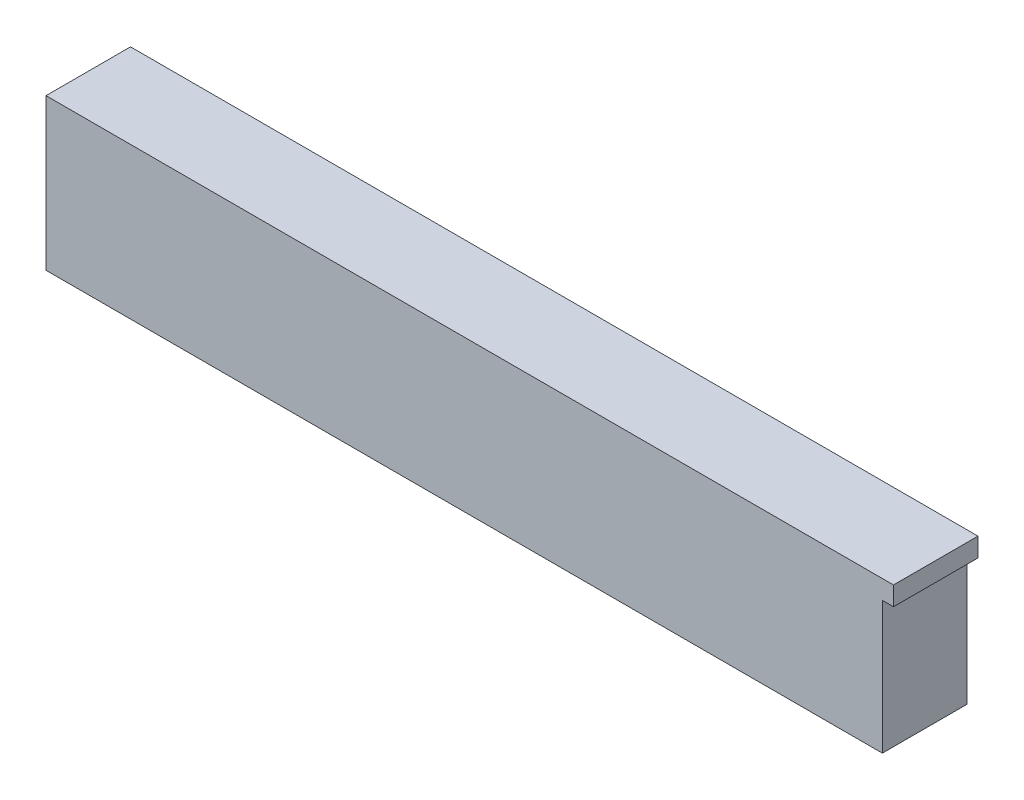
ISO-10303-21;
HEADER;
FILE_DESCRIPTION(('STEP AP214'),'2;1');
FILE_NAME('part.step','',(''),(''),'','','');
FILE_SCHEMA(('AUTOMOTIVE_DESIGN { 1 0 10303 214 1 1 1 1 }'));
ENDSEC;
DATA;
#1=APPLICATION_CONTEXT('core data for automotive mechanical design processes');
#2=APPLICATION_PROTOCOL_DEFINITION('international standard','automotive_design',2000,#1);
#3=PRODUCT_CONTEXT('',#1,'mechanical');
#4=PRODUCT('Part','Part','',(#3));
#5=PRODUCT_RELATED_PRODUCT_CATEGORY('part','',(#4));
#6=PRODUCT_DEFINITION_FORMATION('','',#4);
#7=PRODUCT_DEFINITION_CONTEXT('part definition',#1,'design');
#8=PRODUCT_DEFINITION('design','',#6,#7);
#9=PRODUCT_DEFINITION_SHAPE('','',#8);
#10=(LENGTH_UNIT() NAMED_UNIT(*) SI_UNIT(.MILLI.,.METRE.));
#11=(NAMED_UNIT(*) PLANE_ANGLE_UNIT() SI_UNIT($,.RADIAN.));
#12=(NAMED_UNIT(*) SI_UNIT($,.STERADIAN.) SOLID_ANGLE_UNIT());
#13=UNCERTAINTY_MEASURE_WITH_UNIT(LENGTH_MEASURE(1.E-05),#10,'distance_accuracy_value','');
#14=(GEOMETRIC_REPRESENTATION_CONTEXT(3) GLOBAL_UNCERTAINTY_ASSIGNED_CONTEXT((#13)) GLOBAL_UNIT_ASSIGNED_CONTEXT((#10,
#11,#12)) REPRESENTATION_CONTEXT('',''));
#15=CARTESIAN_POINT('',(0.,0.,0.));
#16=DIRECTION('',(0.,0.,1.));
#17=DIRECTION('',(1.,0.,0.));
#18=AXIS2_PLACEMENT_3D('',#15,#16,#17);
#19=CARTESIAN_POINT('',(376.,0.,38.));
#20=DIRECTION('',(-1.,0.,0.));
#21=DIRECTION('',(0.,0.,1.));
#22=AXIS2_PLACEMENT_3D('',#19,#20,#21);
#23=PLANE('',#22);
#24=DIRECTION('',(0.,0.,-1.));
#25=VECTOR('',#24,1.);
#26=CARTESIAN_POINT('',(376.,59.5,0.));
#27=LINE('',#26,#25);
#28=CARTESIAN_POINT('',(376.,59.5,38.));
#29=VERTEX_POINT('',#28);
#30=CARTESIAN_POINT('',(376.,59.5,0.));
#31=VERTEX_POINT('',#30);
#32=EDGE_CURVE('E61',#29,#31,#27,.T.);
#33=ORIENTED_EDGE('',*,*,#32,.F.);
#34=DIRECTION('',(0.,1.,0.));
#35=VECTOR('',#34,1.);
#36=CARTESIAN_POINT('',(376.,0.,38.));
#37=LINE('',#36,#35);
#38=CARTESIAN_POINT('',(376.,0.,38.));
#39=VERTEX_POINT('',#38);
#40=EDGE_CURVE('E149',#39,#29,#37,.T.);
#41=ORIENTED_EDGE('',*,*,#40,.F.);
#42=DIRECTION('',(0.,0.,-1.));
#43=VECTOR('',#42,1.);
#44=CARTESIAN_POINT('',(376.,0.,38.));
#45=LINE('',#44,#43);
#46=CARTESIAN_POINT('',(376.,0.,0.));
#47=VERTEX_POINT('',#46);
#48=EDGE_CURVE('E54',#39,#47,#45,.T.);
#49=ORIENTED_EDGE('',*,*,#48,.T.);
#50=DIRECTION('',(0.,1.,0.));
#51=VECTOR('',#50,1.);
#52=CARTESIAN_POINT('',(376.,0.,0.));
#53=LINE('',#52,#51);
#54=EDGE_CURVE('E116',#47,#31,#53,.T.);
#55=ORIENTED_EDGE('',*,*,#54,.T.);
#56=EDGE_LOOP('',(#33,#41,#49,#55));
#57=FACE_BOUND('',#56,.T.);
#58=ADVANCED_FACE('F45',(#57),#23,.F.);
#59=CARTESIAN_POINT('',(0.,0.,38.));
#60=DIRECTION('',(1.,0.,0.));
#61=DIRECTION('',(0.,0.,-1.));
#62=AXIS2_PLACEMENT_3D('',#59,#60,#61);
#63=PLANE('',#62);
#64=DIRECTION('',(0.,-1.,0.));
#65=VECTOR('',#64,1.);
#66=CARTESIAN_POINT('',(0.,0.,0.));
#67=LINE('',#66,#65);
#68=CARTESIAN_POINT('',(0.,68.,0.));
#69=VERTEX_POINT('',#68);
#70=CARTESIAN_POINT('',(0.,0.,0.));
#71=VERTEX_POINT('',#70);
#72=EDGE_CURVE('E113',#69,#71,#67,.T.);
#73=ORIENTED_EDGE('',*,*,#72,.T.);
#74=DIRECTION('',(0.,0.,-1.));
#75=VECTOR('',#74,1.);
#76=CARTESIAN_POINT('',(0.,0.,38.));
#77=LINE('',#76,#75);
#78=CARTESIAN_POINT('',(0.,0.,38.));
#79=VERTEX_POINT('',#78);
#80=EDGE_CURVE('E11',#79,#71,#77,.T.);
#81=ORIENTED_EDGE('',*,*,#80,.F.);
#82=DIRECTION('',(0.,-1.,0.));
#83=VECTOR('',#82,1.);
#84=CARTESIAN_POINT('',(0.,0.,38.));
#85=LINE('',#84,#83);
#86=CARTESIAN_POINT('',(0.,68.,38.));
#87=VERTEX_POINT('',#86);
#88=EDGE_CURVE('E115',#87,#79,#85,.T.);
#89=ORIENTED_EDGE('',*,*,#88,.F.);
#90=DIRECTION('',(0.,0.,-1.));
#91=VECTOR('',#90,1.);
#92=CARTESIAN_POINT('',(0.,68.,38.));
#93=LINE('',#92,#91);
#94=EDGE_CURVE('E154',#87,#69,#93,.T.);
#95=ORIENTED_EDGE('',*,*,#94,.T.);
#96=EDGE_LOOP('',(#73,#81,#89,#95));
#97=FACE_BOUND('',#96,.T.);
#98=ADVANCED_FACE('F47',(#97),#63,.F.);
#99=CARTESIAN_POINT('',(0.,0.,38.));
#100=DIRECTION('',(0.,1.,0.));
#101=DIRECTION('',(0.,0.,1.));
#102=AXIS2_PLACEMENT_3D('',#99,#100,#101);
#103=PLANE('',#102);
#104=DIRECTION('',(1.,0.,0.));
#105=VECTOR('',#104,1.);
#106=CARTESIAN_POINT('',(0.,0.,0.));
#107=LINE('',#106,#105);
#108=EDGE_CURVE('E157',#71,#47,#107,.T.);
#109=ORIENTED_EDGE('',*,*,#108,.T.);
#110=ORIENTED_EDGE('',*,*,#48,.F.);
#111=DIRECTION('',(1.,0.,0.));
#112=VECTOR('',#111,1.);
#113=CARTESIAN_POINT('',(0.,0.,38.));
#114=LINE('',#113,#112);
#115=EDGE_CURVE('E93',#79,#39,#114,.T.);
#116=ORIENTED_EDGE('',*,*,#115,.F.);
#117=ORIENTED_EDGE('',*,*,#80,.T.);
#118=EDGE_LOOP('',(#109,#110,#116,#117));
#119=FACE_BOUND('',#118,.T.);
#120=ADVANCED_FACE('F173',(#119),#103,.F.);
#121=CARTESIAN_POINT('',(0.,68.,38.));
#122=DIRECTION('',(0.,-1.,0.));
#123=DIRECTION('',(0.,0.,-1.));
#124=AXIS2_PLACEMENT_3D('',#121,#122,#123);
#125=PLANE('',#124);
#126=DIRECTION('',(-1.,0.,0.));
#127=VECTOR('',#126,1.);
#128=CARTESIAN_POINT('',(0.,68.,0.));
#129=LINE('',#128,#127);
#130=CARTESIAN_POINT('',(381.,68.,0.));
#131=VERTEX_POINT('',#130);
#132=EDGE_CURVE('E88',#131,#69,#129,.T.);
#133=ORIENTED_EDGE('',*,*,#132,.T.);
#134=ORIENTED_EDGE('',*,*,#94,.F.);
#135=DIRECTION('',(-1.,0.,0.));
#136=VECTOR('',#135,1.);
#137=CARTESIAN_POINT('',(0.,68.,38.));
#138=LINE('',#137,#136);
#139=CARTESIAN_POINT('',(381.,68.,38.));
#140=VERTEX_POINT('',#139);
#141=EDGE_CURVE('E70',#140,#87,#138,.T.);
#142=ORIENTED_EDGE('',*,*,#141,.F.);
#143=DIRECTION('',(0.,0.,1.));
#144=VECTOR('',#143,1.);
#145=CARTESIAN_POINT('',(381.,68.,0.));
#146=LINE('',#145,#144);
#147=EDGE_CURVE('E119',#131,#140,#146,.T.);
#148=ORIENTED_EDGE('',*,*,#147,.F.);
#149=EDGE_LOOP('',(#133,#134,#142,#148));
#150=FACE_BOUND('',#149,.T.);
#151=ADVANCED_FACE('F120',(#150),#125,.F.);
#152=CARTESIAN_POINT('',(0.,0.,38.));
#153=DIRECTION('',(0.,0.,-1.));
#154=DIRECTION('',(-1.,0.,0.));
#155=AXIS2_PLACEMENT_3D('',#152,#153,#154);
#156=PLANE('',#155);
#157=ORIENTED_EDGE('',*,*,#88,.T.);
#158=ORIENTED_EDGE('',*,*,#115,.T.);
#159=ORIENTED_EDGE('',*,*,#40,.T.);
#160=DIRECTION('',(-1.,0.,0.));
#161=VECTOR('',#160,1.);
#162=CARTESIAN_POINT('',(381.,59.5,38.));
#163=LINE('',#162,#161);
#164=CARTESIAN_POINT('',(381.,59.5,38.));
#165=VERTEX_POINT('',#164);
#166=EDGE_CURVE('E141',#165,#29,#163,.T.);
#167=ORIENTED_EDGE('',*,*,#166,.F.);
#168=DIRECTION('',(0.,-1.,0.));
#169=VECTOR('',#168,1.);
#170=CARTESIAN_POINT('',(381.,68.,38.));
#171=LINE('',#170,#169);
#172=EDGE_CURVE('E123',#140,#165,#171,.T.);
#173=ORIENTED_EDGE('',*,*,#172,.F.);
#174=ORIENTED_EDGE('',*,*,#141,.T.);
#175=EDGE_LOOP('',(#157,#158,#159,#167,#173,#174));
#176=FACE_BOUND('',#175,.T.);
#177=ADVANCED_FACE('F169',(#176),#156,.F.);
#178=CARTESIAN_POINT('',(0.,0.,0.));
#179=DIRECTION('',(0.,0.,-1.));
#180=DIRECTION('',(-1.,0.,0.));
#181=AXIS2_PLACEMENT_3D('',#178,#179,#180);
#182=PLANE('',#181);
#183=ORIENTED_EDGE('',*,*,#72,.F.);
#184=ORIENTED_EDGE('',*,*,#132,.F.);
#185=DIRECTION('',(0.,1.,0.));
#186=VECTOR('',#185,1.);
#187=CARTESIAN_POINT('',(381.,68.,0.));
#188=LINE('',#187,#186);
#189=CARTESIAN_POINT('',(381.,59.5,0.));
#190=VERTEX_POINT('',#189);
#191=EDGE_CURVE('E111',#190,#131,#188,.T.);
#192=ORIENTED_EDGE('',*,*,#191,.F.);
#193=DIRECTION('',(-1.,0.,0.));
#194=VECTOR('',#193,1.);
#195=CARTESIAN_POINT('',(381.,59.5,0.));
#196=LINE('',#195,#194);
#197=EDGE_CURVE('E137',#190,#31,#196,.T.);
#198=ORIENTED_EDGE('',*,*,#197,.T.);
#199=ORIENTED_EDGE('',*,*,#54,.F.);
#200=ORIENTED_EDGE('',*,*,#108,.F.);
#201=EDGE_LOOP('',(#183,#184,#192,#198,#199,#200));
#202=FACE_BOUND('',#201,.T.);
#203=ADVANCED_FACE('F108',(#202),#182,.T.);
#204=CARTESIAN_POINT('',(381.,59.5,0.));
#205=DIRECTION('',(0.,1.,0.));
#206=DIRECTION('',(0.,0.,1.));
#207=AXIS2_PLACEMENT_3D('',#204,#205,#206);
#208=PLANE('',#207);
#209=ORIENTED_EDGE('',*,*,#32,.T.);
#210=ORIENTED_EDGE('',*,*,#197,.F.);
#211=DIRECTION('',(0.,0.,-1.));
#212=VECTOR('',#211,1.);
#213=CARTESIAN_POINT('',(381.,59.5,0.));
#214=LINE('',#213,#212);
#215=EDGE_CURVE('E127',#165,#190,#214,.T.);
#216=ORIENTED_EDGE('',*,*,#215,.F.);
#217=ORIENTED_EDGE('',*,*,#166,.T.);
#218=EDGE_LOOP('',(#209,#210,#216,#217));
#219=FACE_BOUND('',#218,.T.);
#220=ADVANCED_FACE('F167',(#219),#208,.F.);
#221=CARTESIAN_POINT('',(381.,0.,0.));
#222=DIRECTION('',(-1.,0.,0.));
#223=DIRECTION('',(0.,0.,1.));
#224=AXIS2_PLACEMENT_3D('',#221,#222,#223);
#225=PLANE('',#224);
#226=ORIENTED_EDGE('',*,*,#191,.T.);
#227=ORIENTED_EDGE('',*,*,#147,.T.);
#228=ORIENTED_EDGE('',*,*,#172,.T.);
#229=ORIENTED_EDGE('',*,*,#215,.T.);
#230=EDGE_LOOP('',(#226,#227,#228,#229));
#231=FACE_BOUND('',#230,.T.);
#232=ADVANCED_FACE('F125',(#231),#225,.F.);
#233=CLOSED_SHELL('',(#58,#98,#120,#151,#177,#203,#220,#232));
#234=MANIFOLD_SOLID_BREP('B2',#233);
#235=ADVANCED_BREP_SHAPE_REPRESENTATION('',(#18,#234),#14);
#236=SHAPE_DEFINITION_REPRESENTATION(#9,#235);
ENDSEC;
END-ISO-10303-21;
